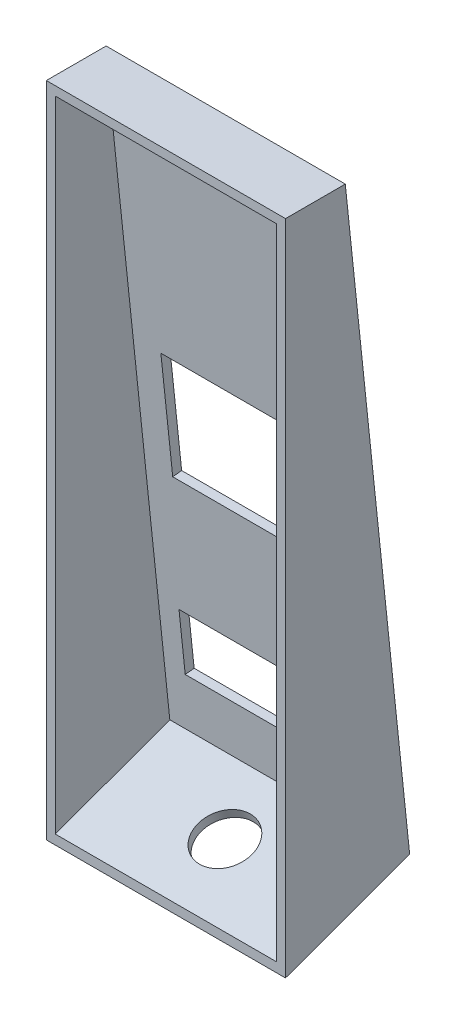
ISO-10303-21;
HEADER;
FILE_DESCRIPTION(('STEP AP214'),'2;1');
FILE_NAME('part.step','',(''),(''),'','','');
FILE_SCHEMA(('AUTOMOTIVE_DESIGN { 1 0 10303 214 1 1 1 1 }'));
ENDSEC;
DATA;
#1=APPLICATION_CONTEXT('core data for automotive mechanical design processes');
#2=APPLICATION_PROTOCOL_DEFINITION('international standard','automotive_design',2000,#1);
#3=PRODUCT_CONTEXT('',#1,'mechanical');
#4=PRODUCT('Part','Part','',(#3));
#5=PRODUCT_RELATED_PRODUCT_CATEGORY('part','',(#4));
#6=PRODUCT_DEFINITION_FORMATION('','',#4);
#7=PRODUCT_DEFINITION_CONTEXT('part definition',#1,'design');
#8=PRODUCT_DEFINITION('design','',#6,#7);
#9=PRODUCT_DEFINITION_SHAPE('','',#8);
#10=(LENGTH_UNIT() NAMED_UNIT(*) SI_UNIT(.MILLI.,.METRE.));
#11=(NAMED_UNIT(*) PLANE_ANGLE_UNIT() SI_UNIT($,.RADIAN.));
#12=(NAMED_UNIT(*) SI_UNIT($,.STERADIAN.) SOLID_ANGLE_UNIT());
#13=UNCERTAINTY_MEASURE_WITH_UNIT(LENGTH_MEASURE(1.E-05),#10,'distance_accuracy_value','');
#14=(GEOMETRIC_REPRESENTATION_CONTEXT(3) GLOBAL_UNCERTAINTY_ASSIGNED_CONTEXT((#13)) GLOBAL_UNIT_ASSIGNED_CONTEXT((#10,
#11,#12)) REPRESENTATION_CONTEXT('',''));
#15=CARTESIAN_POINT('',(0.,0.,0.));
#16=DIRECTION('',(0.,0.,1.));
#17=DIRECTION('',(1.,0.,0.));
#18=AXIS2_PLACEMENT_3D('',#15,#16,#17);
#19=CARTESIAN_POINT('',(0.,0.,0.));
#20=DIRECTION('',(0.,0.,-1.));
#21=DIRECTION('',(-1.,0.,0.));
#22=AXIS2_PLACEMENT_3D('',#19,#20,#21);
#23=PLANE('',#22);
#24=DIRECTION('',(0.,1.,0.));
#25=VECTOR('',#24,1.);
#26=CARTESIAN_POINT('',(0.,-2930.,0.));
#27=LINE('',#26,#25);
#28=CARTESIAN_POINT('',(1.50631556295124E-13,-4030.,0.));
#29=VERTEX_POINT('',#28);
#30=CARTESIAN_POINT('',(0.,-2930.,0.));
#31=VERTEX_POINT('',#30);
#32=EDGE_CURVE('E368',#29,#31,#27,.T.);
#33=ORIENTED_EDGE('',*,*,#32,.T.);
#34=DIRECTION('',(-1.,0.,0.));
#35=VECTOR('',#34,1.);
#36=CARTESIAN_POINT('',(0.,-2930.,0.));
#37=LINE('',#36,#35);
#38=CARTESIAN_POINT('',(-400.,-2930.,0.));
#39=VERTEX_POINT('',#38);
#40=EDGE_CURVE('E12',#31,#39,#37,.T.);
#41=ORIENTED_EDGE('',*,*,#40,.T.);
#42=DIRECTION('',(0.,-1.,0.));
#43=VECTOR('',#42,1.);
#44=CARTESIAN_POINT('',(-400.,-2930.,0.));
#45=LINE('',#44,#43);
#46=CARTESIAN_POINT('',(-400.,-4030.,0.));
#47=VERTEX_POINT('',#46);
#48=EDGE_CURVE('E54',#39,#47,#45,.T.);
#49=ORIENTED_EDGE('',*,*,#48,.T.);
#50=DIRECTION('',(1.,0.,0.));
#51=VECTOR('',#50,1.);
#52=CARTESIAN_POINT('',(1.50631556295124E-13,-4030.,0.));
#53=LINE('',#52,#51);
#54=EDGE_CURVE('E371',#47,#29,#53,.T.);
#55=ORIENTED_EDGE('',*,*,#54,.T.);
#56=EDGE_LOOP('',(#33,#41,#49,#55));
#57=FACE_BOUND('',#56,.T.);
#58=DIRECTION('',(0.,1.,0.));
#59=VECTOR('',#58,1.);
#60=CARTESIAN_POINT('',(-15.0000000000004,0.,0.));
#61=LINE('',#60,#59);
#62=CARTESIAN_POINT('',(-14.9999999999999,-4014.03587983747,0.));
#63=VERTEX_POINT('',#62);
#64=CARTESIAN_POINT('',(-15.,-2945.,0.));
#65=VERTEX_POINT('',#64);
#66=EDGE_CURVE('E195',#63,#65,#61,.T.);
#67=ORIENTED_EDGE('',*,*,#66,.F.);
#68=DIRECTION('',(1.,0.,0.));
#69=VECTOR('',#68,1.);
#70=CARTESIAN_POINT('',(0.,-4014.03587983747,0.));
#71=LINE('',#70,#69);
#72=CARTESIAN_POINT('',(-385.,-4014.03587983747,0.));
#73=VERTEX_POINT('',#72);
#74=EDGE_CURVE('E173',#73,#63,#71,.T.);
#75=ORIENTED_EDGE('',*,*,#74,.F.);
#76=DIRECTION('',(0.,-1.,0.));
#77=VECTOR('',#76,1.);
#78=CARTESIAN_POINT('',(-385.,0.,0.));
#79=LINE('',#78,#77);
#80=CARTESIAN_POINT('',(-385.,-2945.,0.));
#81=VERTEX_POINT('',#80);
#82=EDGE_CURVE('E212',#81,#73,#79,.T.);
#83=ORIENTED_EDGE('',*,*,#82,.F.);
#84=DIRECTION('',(-1.,0.,0.));
#85=VECTOR('',#84,1.);
#86=CARTESIAN_POINT('',(0.,-2945.,0.));
#87=LINE('',#86,#85);
#88=EDGE_CURVE('E214',#65,#81,#87,.T.);
#89=ORIENTED_EDGE('',*,*,#88,.F.);
#90=EDGE_LOOP('',(#67,#75,#83,#89));
#91=FACE_BOUND('',#90,.T.);
#92=ADVANCED_FACE('F45',(#57,#91),#23,.F.);
#93=CARTESIAN_POINT('',(-61.5,-3362.87083817174,-95.2211444366778));
#94=DIRECTION('',(0.,-0.994521895368273,-0.104528463267654));
#95=DIRECTION('',(0.,0.104528463267654,-0.994521895368273));
#96=AXIS2_PLACEMENT_3D('',#93,#94,#95);
#97=PLANE('',#96);
#98=DIRECTION('',(0.,0.104528463267654,-0.994521895368273));
#99=VECTOR('',#98,1.);
#100=CARTESIAN_POINT('',(-61.5,-3362.87083817174,-95.2211444366778));
#101=LINE('',#100,#99);
#102=CARTESIAN_POINT('',(-61.5,-3359.21234195737,-130.029410774567));
#103=VERTEX_POINT('',#102);
#104=CARTESIAN_POINT('',(-61.5,-3357.64441500836,-144.947239205091));
#105=VERTEX_POINT('',#104);
#106=EDGE_CURVE('E245',#103,#105,#101,.T.);
#107=ORIENTED_EDGE('',*,*,#106,.F.);
#108=DIRECTION('',(-1.,0.,0.));
#109=VECTOR('',#108,1.);
#110=CARTESIAN_POINT('',(0.,-3359.21234195737,-130.029410774567));
#111=LINE('',#110,#109);
#112=CARTESIAN_POINT('',(-338.5,-3359.21234195737,-130.029410774567));
#113=VERTEX_POINT('',#112);
#114=EDGE_CURVE('E70',#103,#113,#111,.T.);
#115=ORIENTED_EDGE('',*,*,#114,.T.);
#116=DIRECTION('',(0.,0.104528463267654,-0.994521895368273));
#117=VECTOR('',#116,1.);
#118=CARTESIAN_POINT('',(-338.5,-3362.87083817174,-95.2211444366778));
#119=LINE('',#118,#117);
#120=CARTESIAN_POINT('',(-338.5,-3357.64441500836,-144.947239205091));
#121=VERTEX_POINT('',#120);
#122=EDGE_CURVE('E216',#113,#121,#119,.T.);
#123=ORIENTED_EDGE('',*,*,#122,.T.);
#124=DIRECTION('',(-1.,0.,0.));
#125=VECTOR('',#124,1.);
#126=CARTESIAN_POINT('',(-61.5,-3357.64441500836,-144.947239205091));
#127=LINE('',#126,#125);
#128=EDGE_CURVE('E222',#105,#121,#127,.T.);
#129=ORIENTED_EDGE('',*,*,#128,.F.);
#130=EDGE_LOOP('',(#107,#115,#123,#129));
#131=FACE_BOUND('',#130,.T.);
#132=ADVANCED_FACE('F426',(#131),#97,.T.);
#133=CARTESIAN_POINT('',(-338.5,-3362.87083817174,-95.2211444366778));
#134=DIRECTION('',(1.,0.,0.));
#135=DIRECTION('',(0.,0.,-1.));
#136=AXIS2_PLACEMENT_3D('',#133,#134,#135);
#137=PLANE('',#136);
#138=ORIENTED_EDGE('',*,*,#122,.F.);
#139=DIRECTION('',(0.,-0.994521895368273,-0.104528463267654));
#140=VECTOR('',#139,1.);
#141=CARTESIAN_POINT('',(-338.5,-23.1861073331016,220.601075441851));
#142=LINE('',#141,#140);
#143=CARTESIAN_POINT('',(-338.5,-3548.17150207734,-149.889818795421));
#144=VERTEX_POINT('',#143);
#145=EDGE_CURVE('E207',#113,#144,#142,.T.);
#146=ORIENTED_EDGE('',*,*,#145,.T.);
#147=DIRECTION('',(0.,0.104528463267654,-0.994521895368273));
#148=VECTOR('',#147,1.);
#149=CARTESIAN_POINT('',(-338.5,-3551.82999829171,-115.081552457532));
#150=LINE('',#149,#148);
#151=CARTESIAN_POINT('',(-338.5,-3546.60357512833,-164.807647225946));
#152=VERTEX_POINT('',#151);
#153=EDGE_CURVE('E241',#144,#152,#150,.T.);
#154=ORIENTED_EDGE('',*,*,#153,.T.);
#155=DIRECTION('',(0.,-0.994521895368273,-0.104528463267653));
#156=VECTOR('',#155,1.);
#157=CARTESIAN_POINT('',(-338.5,-3357.64441500836,-144.947239205091));
#158=LINE('',#157,#156);
#159=EDGE_CURVE('E253',#121,#152,#158,.T.);
#160=ORIENTED_EDGE('',*,*,#159,.F.);
#161=EDGE_LOOP('',(#138,#146,#154,#160));
#162=FACE_BOUND('',#161,.T.);
#163=ADVANCED_FACE('F430',(#162),#137,.T.);
#164=CARTESIAN_POINT('',(-61.5,-3551.82999829171,-115.081552457532));
#165=DIRECTION('',(0.,-0.994521895368273,-0.104528463267654));
#166=DIRECTION('',(0.,0.104528463267654,-0.994521895368273));
#167=AXIS2_PLACEMENT_3D('',#164,#165,#166);
#168=PLANE('',#167);
#169=DIRECTION('',(-1.,0.,0.));
#170=VECTOR('',#169,1.);
#171=CARTESIAN_POINT('',(0.,-3548.17150207734,-149.889818795421));
#172=LINE('',#171,#170);
#173=CARTESIAN_POINT('',(-61.5,-3548.17150207734,-149.889818795421));
#174=VERTEX_POINT('',#173);
#175=EDGE_CURVE('E205',#174,#144,#172,.T.);
#176=ORIENTED_EDGE('',*,*,#175,.F.);
#177=DIRECTION('',(0.,0.104528463267654,-0.994521895368273));
#178=VECTOR('',#177,1.);
#179=CARTESIAN_POINT('',(-61.5,-3551.82999829171,-115.081552457532));
#180=LINE('',#179,#178);
#181=CARTESIAN_POINT('',(-61.5,-3546.60357512833,-164.807647225946));
#182=VERTEX_POINT('',#181);
#183=EDGE_CURVE('E243',#174,#182,#180,.T.);
#184=ORIENTED_EDGE('',*,*,#183,.T.);
#185=DIRECTION('',(-1.,0.,0.));
#186=VECTOR('',#185,1.);
#187=CARTESIAN_POINT('',(-61.5,-3546.60357512833,-164.807647225946));
#188=LINE('',#187,#186);
#189=EDGE_CURVE('E250',#182,#152,#188,.T.);
#190=ORIENTED_EDGE('',*,*,#189,.T.);
#191=ORIENTED_EDGE('',*,*,#153,.F.);
#192=EDGE_LOOP('',(#176,#184,#190,#191));
#193=FACE_BOUND('',#192,.T.);
#194=ADVANCED_FACE('F436',(#193),#168,.F.);
#195=CARTESIAN_POINT('',(-61.5,-3362.87083817174,-95.2211444366778));
#196=DIRECTION('',(1.,0.,0.));
#197=DIRECTION('',(0.,0.,-1.));
#198=AXIS2_PLACEMENT_3D('',#195,#196,#197);
#199=PLANE('',#198);
#200=DIRECTION('',(0.,-0.994521895368273,-0.104528463267654));
#201=VECTOR('',#200,1.);
#202=CARTESIAN_POINT('',(-61.5,-23.1861073331016,220.601075441851));
#203=LINE('',#202,#201);
#204=EDGE_CURVE('E203',#103,#174,#203,.T.);
#205=ORIENTED_EDGE('',*,*,#204,.F.);
#206=ORIENTED_EDGE('',*,*,#106,.T.);
#207=DIRECTION('',(0.,-0.994521895368273,-0.104528463267653));
#208=VECTOR('',#207,1.);
#209=CARTESIAN_POINT('',(-61.5,-3357.64441500836,-144.947239205091));
#210=LINE('',#209,#208);
#211=EDGE_CURVE('E247',#105,#182,#210,.T.);
#212=ORIENTED_EDGE('',*,*,#211,.T.);
#213=ORIENTED_EDGE('',*,*,#183,.F.);
#214=EDGE_LOOP('',(#205,#206,#212,#213));
#215=FACE_BOUND('',#214,.T.);
#216=ADVANCED_FACE('F446',(#215),#199,.F.);
#217=CARTESIAN_POINT('',(0.,-3860.13178585588,-147.485376070505));
#218=DIRECTION('',(0.,-0.994521895368273,-0.104528463267654));
#219=DIRECTION('',(0.,0.104528463267654,-0.994521895368273));
#220=AXIS2_PLACEMENT_3D('',#217,#218,#219);
#221=PLANE('',#220);
#222=DIRECTION('',(-1.,0.,0.));
#223=VECTOR('',#222,1.);
#224=CARTESIAN_POINT('',(0.,-3856.47328964151,-182.293642408394));
#225=LINE('',#224,#223);
#226=CARTESIAN_POINT('',(-50.,-3856.47328964151,-182.293642408394));
#227=VERTEX_POINT('',#226);
#228=CARTESIAN_POINT('',(-350.,-3856.47328964151,-182.293642408394));
#229=VERTEX_POINT('',#228);
#230=EDGE_CURVE('E197',#227,#229,#225,.T.);
#231=ORIENTED_EDGE('',*,*,#230,.F.);
#232=DIRECTION('',(0.,0.104528463267654,-0.994521895368273));
#233=VECTOR('',#232,1.);
#234=CARTESIAN_POINT('',(-50.,-3860.13178585588,-147.485376070505));
#235=LINE('',#234,#233);
#236=CARTESIAN_POINT('',(-50.,-3854.90536269249,-197.211470838918));
#237=VERTEX_POINT('',#236);
#238=EDGE_CURVE('E232',#227,#237,#235,.T.);
#239=ORIENTED_EDGE('',*,*,#238,.T.);
#240=DIRECTION('',(-1.,0.,0.));
#241=VECTOR('',#240,1.);
#242=CARTESIAN_POINT('',(0.,-3854.90536269249,-197.211470838918));
#243=LINE('',#242,#241);
#244=CARTESIAN_POINT('',(-350.,-3854.9053626925,-197.211470838918));
#245=VERTEX_POINT('',#244);
#246=EDGE_CURVE('E218',#237,#245,#243,.T.);
#247=ORIENTED_EDGE('',*,*,#246,.T.);
#248=DIRECTION('',(0.,0.104528463267654,-0.994521895368273));
#249=VECTOR('',#248,1.);
#250=CARTESIAN_POINT('',(-350.,-3860.13178585588,-147.485376070505));
#251=LINE('',#250,#249);
#252=EDGE_CURVE('E231',#229,#245,#251,.T.);
#253=ORIENTED_EDGE('',*,*,#252,.F.);
#254=EDGE_LOOP('',(#231,#239,#247,#253));
#255=FACE_BOUND('',#254,.T.);
#256=ADVANCED_FACE('F441',(#255),#221,.F.);
#257=CARTESIAN_POINT('',(-49.999999999999,-26.8446035474695,255.409341779741));
#258=DIRECTION('',(-1.,0.,0.));
#259=DIRECTION('',(0.,-1.,0.));
#260=AXIS2_PLACEMENT_3D('',#257,#258,#259);
#261=PLANE('',#260);
#262=ORIENTED_EDGE('',*,*,#238,.F.);
#263=DIRECTION('',(0.,0.994521895368273,0.104528463267654));
#264=VECTOR('',#263,1.);
#265=CARTESIAN_POINT('',(-49.999999999999,-23.1861073331016,220.601075441851));
#266=LINE('',#265,#264);
#267=CARTESIAN_POINT('',(-50.,-3757.02110010468,-171.840796081628));
#268=VERTEX_POINT('',#267);
#269=EDGE_CURVE('E181',#227,#268,#266,.T.);
#270=ORIENTED_EDGE('',*,*,#269,.T.);
#271=DIRECTION('',(0.,0.104528463267654,-0.994521895368273));
#272=VECTOR('',#271,1.);
#273=CARTESIAN_POINT('',(-50.,-3760.67959631905,-137.032529743739));
#274=LINE('',#273,#272);
#275=CARTESIAN_POINT('',(-50.,-3755.45317315567,-186.758624512153));
#276=VERTEX_POINT('',#275);
#277=EDGE_CURVE('E235',#268,#276,#274,.T.);
#278=ORIENTED_EDGE('',*,*,#277,.T.);
#279=DIRECTION('',(0.,0.994521895368273,0.104528463267654));
#280=VECTOR('',#279,1.);
#281=CARTESIAN_POINT('',(-49.999999999999,-21.6181803840868,205.683247011327));
#282=LINE('',#281,#280);
#283=EDGE_CURVE('E228',#237,#276,#282,.T.);
#284=ORIENTED_EDGE('',*,*,#283,.F.);
#285=EDGE_LOOP('',(#262,#270,#278,#284));
#286=FACE_BOUND('',#285,.T.);
#287=ADVANCED_FACE('F513',(#286),#261,.T.);
#288=CARTESIAN_POINT('',(0.,-3760.67959631905,-137.032529743739));
#289=DIRECTION('',(0.,-0.994521895368273,-0.104528463267654));
#290=DIRECTION('',(0.,0.104528463267654,-0.994521895368273));
#291=AXIS2_PLACEMENT_3D('',#288,#289,#290);
#292=PLANE('',#291);
#293=ORIENTED_EDGE('',*,*,#277,.F.);
#294=DIRECTION('',(-1.,0.,0.));
#295=VECTOR('',#294,1.);
#296=CARTESIAN_POINT('',(0.,-3757.02110010468,-171.840796081628));
#297=LINE('',#296,#295);
#298=CARTESIAN_POINT('',(-350.,-3757.02110010468,-171.840796081628));
#299=VERTEX_POINT('',#298);
#300=EDGE_CURVE('E184',#268,#299,#297,.T.);
#301=ORIENTED_EDGE('',*,*,#300,.T.);
#302=DIRECTION('',(0.,0.104528463267654,-0.994521895368273));
#303=VECTOR('',#302,1.);
#304=CARTESIAN_POINT('',(-350.,-3760.67959631905,-137.032529743739));
#305=LINE('',#304,#303);
#306=CARTESIAN_POINT('',(-350.,-3755.45317315567,-186.758624512153));
#307=VERTEX_POINT('',#306);
#308=EDGE_CURVE('E237',#299,#307,#305,.T.);
#309=ORIENTED_EDGE('',*,*,#308,.T.);
#310=DIRECTION('',(-1.,0.,0.));
#311=VECTOR('',#310,1.);
#312=CARTESIAN_POINT('',(0.,-3755.45317315567,-186.758624512153));
#313=LINE('',#312,#311);
#314=EDGE_CURVE('E225',#276,#307,#313,.T.);
#315=ORIENTED_EDGE('',*,*,#314,.F.);
#316=EDGE_LOOP('',(#293,#301,#309,#315));
#317=FACE_BOUND('',#316,.T.);
#318=ADVANCED_FACE('F516',(#317),#292,.T.);
#319=CARTESIAN_POINT('',(-350.000000000002,-26.8446035474697,255.409341779741));
#320=DIRECTION('',(-1.,0.,0.));
#321=DIRECTION('',(0.,-1.,0.));
#322=AXIS2_PLACEMENT_3D('',#319,#320,#321);
#323=PLANE('',#322);
#324=DIRECTION('',(0.,0.994521895368273,0.104528463267654));
#325=VECTOR('',#324,1.);
#326=CARTESIAN_POINT('',(-350.000000000002,-23.1861073331018,220.601075441851));
#327=LINE('',#326,#325);
#328=EDGE_CURVE('E199',#229,#299,#327,.T.);
#329=ORIENTED_EDGE('',*,*,#328,.F.);
#330=ORIENTED_EDGE('',*,*,#252,.T.);
#331=DIRECTION('',(0.,0.994521895368273,0.104528463267654));
#332=VECTOR('',#331,1.);
#333=CARTESIAN_POINT('',(-350.000000000002,-21.618180384087,205.683247011327));
#334=LINE('',#333,#332);
#335=EDGE_CURVE('E221',#245,#307,#334,.T.);
#336=ORIENTED_EDGE('',*,*,#335,.T.);
#337=ORIENTED_EDGE('',*,*,#308,.F.);
#338=EDGE_LOOP('',(#329,#330,#336,#337));
#339=FACE_BOUND('',#338,.T.);
#340=ADVANCED_FACE('F422',(#339),#323,.F.);
#341=CARTESIAN_POINT('',(0.,-21.6181803840868,205.683247011327));
#342=DIRECTION('',(0.,0.104528463267654,-0.994521895368273));
#343=DIRECTION('',(0.,0.994521895368273,0.104528463267654));
#344=AXIS2_PLACEMENT_3D('',#341,#342,#343);
#345=PLANE('',#344);
#346=ORIENTED_EDGE('',*,*,#246,.F.);
#347=ORIENTED_EDGE('',*,*,#283,.T.);
#348=ORIENTED_EDGE('',*,*,#314,.T.);
#349=ORIENTED_EDGE('',*,*,#335,.F.);
#350=EDGE_LOOP('',(#346,#347,#348,#349));
#351=FACE_BOUND('',#350,.T.);
#352=DIRECTION('',(0.,-0.994521895368273,-0.104528463267654));
#353=VECTOR('',#352,1.);
#354=CARTESIAN_POINT('',(0.,-2930.,-99.9999999999999));
#355=LINE('',#354,#353);
#356=CARTESIAN_POINT('',(0.,-2930.,-99.9999999999999));
#357=VERTEX_POINT('',#356);
#358=CARTESIAN_POINT('',(0.,-3954.35755222932,-207.664317165683));
#359=VERTEX_POINT('',#358);
#360=EDGE_CURVE('E234',#357,#359,#355,.T.);
#361=ORIENTED_EDGE('',*,*,#360,.T.);
#362=DIRECTION('',(-1.,0.,0.));
#363=VECTOR('',#362,1.);
#364=CARTESIAN_POINT('',(0.,-3954.35755222932,-207.664317165683));
#365=LINE('',#364,#363);
#366=CARTESIAN_POINT('',(-400.,-3954.35755222932,-207.664317165683));
#367=VERTEX_POINT('',#366);
#368=EDGE_CURVE('E339',#359,#367,#365,.T.);
#369=ORIENTED_EDGE('',*,*,#368,.T.);
#370=DIRECTION('',(0.,0.994521895368273,0.104528463267654));
#371=VECTOR('',#370,1.);
#372=CARTESIAN_POINT('',(-400.,-2930.,-99.9999999999999));
#373=LINE('',#372,#371);
#374=CARTESIAN_POINT('',(-400.,-2930.,-99.9999999999999));
#375=VERTEX_POINT('',#374);
#376=EDGE_CURVE('E474',#367,#375,#373,.T.);
#377=ORIENTED_EDGE('',*,*,#376,.T.);
#378=DIRECTION('',(1.,0.,0.));
#379=VECTOR('',#378,1.);
#380=CARTESIAN_POINT('',(0.,-2930.,-99.9999999999999));
#381=LINE('',#380,#379);
#382=EDGE_CURVE('E263',#375,#357,#381,.T.);
#383=ORIENTED_EDGE('',*,*,#382,.T.);
#384=EDGE_LOOP('',(#361,#369,#377,#383));
#385=FACE_BOUND('',#384,.T.);
#386=ORIENTED_EDGE('',*,*,#211,.F.);
#387=ORIENTED_EDGE('',*,*,#128,.T.);
#388=ORIENTED_EDGE('',*,*,#159,.T.);
#389=ORIENTED_EDGE('',*,*,#189,.F.);
#390=EDGE_LOOP('',(#386,#387,#388,#389));
#391=FACE_BOUND('',#390,.T.);
#392=ADVANCED_FACE('F417',(#351,#385,#391),#345,.T.);
#393=CARTESIAN_POINT('',(0.,-3557.93154621514,-1295.98890569872));
#394=DIRECTION('',(0.,0.939607059285868,0.342255130188232));
#395=DIRECTION('',(0.,-0.342255130188232,0.939607059285868));
#396=AXIS2_PLACEMENT_3D('',#393,#394,#395);
#397=PLANE('',#396);
#398=CARTESIAN_POINT('',(-200.,-3992.17877611466,-103.832158582843));
#399=DIRECTION('',(0.,-0.939607059285867,-0.342255130188236));
#400=DIRECTION('',(0.,0.342255130188236,-0.939607059285866));
#401=AXIS2_PLACEMENT_3D('',#398,#399,#400);
#402=CIRCLE('',#401,45.);
#403=CARTESIAN_POINT('',(-200.,-3976.77729525619,-146.114476250707));
#404=VERTEX_POINT('',#403);
#405=EDGE_CURVE('E187',#404,#404,#402,.T.);
#406=ORIENTED_EDGE('',*,*,#405,.F.);
#407=EDGE_LOOP('',(#406));
#408=FACE_BOUND('',#407,.T.);
#409=DIRECTION('',(0.,-0.342255130188232,0.939607059285868));
#410=VECTOR('',#409,1.);
#411=CARTESIAN_POINT('',(0.,-3954.35755222932,-207.664317165683));
#412=LINE('',#411,#410);
#413=EDGE_CURVE('E331',#359,#29,#412,.T.);
#414=ORIENTED_EDGE('',*,*,#413,.T.);
#415=ORIENTED_EDGE('',*,*,#54,.F.);
#416=DIRECTION('',(0.,-0.342255130188232,0.939607059285868));
#417=VECTOR('',#416,1.);
#418=CARTESIAN_POINT('',(-400.,-3954.35755222932,-207.664317165683));
#419=LINE('',#418,#417);
#420=EDGE_CURVE('E323',#367,#47,#419,.T.);
#421=ORIENTED_EDGE('',*,*,#420,.F.);
#422=ORIENTED_EDGE('',*,*,#368,.F.);
#423=EDGE_LOOP('',(#414,#415,#421,#422));
#424=FACE_BOUND('',#423,.T.);
#425=ADVANCED_FACE('F313',(#408,#424),#397,.F.);
#426=CARTESIAN_POINT('',(-400.,0.,1.0298214702507E-13));
#427=DIRECTION('',(-1.,0.,0.));
#428=DIRECTION('',(0.,0.,1.));
#429=AXIS2_PLACEMENT_3D('',#426,#427,#428);
#430=PLANE('',#429);
#431=ORIENTED_EDGE('',*,*,#420,.T.);
#432=ORIENTED_EDGE('',*,*,#48,.F.);
#433=DIRECTION('',(0.,0.,1.));
#434=VECTOR('',#433,1.);
#435=CARTESIAN_POINT('',(-400.,-2930.,-99.9999999999999));
#436=LINE('',#435,#434);
#437=EDGE_CURVE('E268',#375,#39,#436,.T.);
#438=ORIENTED_EDGE('',*,*,#437,.F.);
#439=ORIENTED_EDGE('',*,*,#376,.F.);
#440=EDGE_LOOP('',(#431,#432,#438,#439));
#441=FACE_BOUND('',#440,.T.);
#442=ADVANCED_FACE('F304',(#441),#430,.T.);
#443=CARTESIAN_POINT('',(-4.01227690858831E-13,0.,0.));
#444=DIRECTION('',(-1.,0.,0.));
#445=DIRECTION('',(0.,-1.,0.));
#446=AXIS2_PLACEMENT_3D('',#443,#444,#445);
#447=PLANE('',#446);
#448=DIRECTION('',(0.,0.,1.));
#449=VECTOR('',#448,1.);
#450=CARTESIAN_POINT('',(0.,-2930.,-99.9999999999999));
#451=LINE('',#450,#449);
#452=EDGE_CURVE('E330',#357,#31,#451,.T.);
#453=ORIENTED_EDGE('',*,*,#452,.T.);
#454=ORIENTED_EDGE('',*,*,#32,.F.);
#455=ORIENTED_EDGE('',*,*,#413,.F.);
#456=ORIENTED_EDGE('',*,*,#360,.F.);
#457=EDGE_LOOP('',(#453,#454,#455,#456));
#458=FACE_BOUND('',#457,.T.);
#459=ADVANCED_FACE('F279',(#458),#447,.F.);
#460=CARTESIAN_POINT('',(0.,-2930.,1.30118138486068E-11));
#461=DIRECTION('',(0.,-1.,0.));
#462=DIRECTION('',(0.,0.,-1.));
#463=AXIS2_PLACEMENT_3D('',#460,#461,#462);
#464=PLANE('',#463);
#465=ORIENTED_EDGE('',*,*,#437,.T.);
#466=ORIENTED_EDGE('',*,*,#40,.F.);
#467=ORIENTED_EDGE('',*,*,#452,.F.);
#468=ORIENTED_EDGE('',*,*,#382,.F.);
#469=EDGE_LOOP('',(#465,#466,#467,#468));
#470=FACE_BOUND('',#469,.T.);
#471=ADVANCED_FACE('F270',(#470),#464,.F.);
#472=CARTESIAN_POINT('',(0.,-23.1861073331016,220.601075441851));
#473=DIRECTION('',(0.,0.104528463267654,-0.994521895368273));
#474=DIRECTION('',(0.,0.994521895368273,0.104528463267654));
#475=AXIS2_PLACEMENT_3D('',#472,#473,#474);
#476=PLANE('',#475);
#477=ORIENTED_EDGE('',*,*,#230,.T.);
#478=ORIENTED_EDGE('',*,*,#328,.T.);
#479=ORIENTED_EDGE('',*,*,#300,.F.);
#480=ORIENTED_EDGE('',*,*,#269,.F.);
#481=EDGE_LOOP('',(#477,#478,#479,#480));
#482=FACE_BOUND('',#481,.T.);
#483=DIRECTION('',(0.,-0.994521895368273,-0.104528463267654));
#484=VECTOR('',#483,1.);
#485=CARTESIAN_POINT('',(-15.0000000000004,-23.1861073331016,220.601075441851));
#486=LINE('',#485,#484);
#487=CARTESIAN_POINT('',(-15.,-2945.,-86.4939393355323));
#488=VERTEX_POINT('',#487);
#489=CARTESIAN_POINT('',(-14.9999999999999,-3944.27339787691,-191.521805640719));
#490=VERTEX_POINT('',#489);
#491=EDGE_CURVE('E164',#488,#490,#486,.T.);
#492=ORIENTED_EDGE('',*,*,#491,.F.);
#493=DIRECTION('',(1.,0.,0.));
#494=VECTOR('',#493,1.);
#495=CARTESIAN_POINT('',(0.,-2945.,-86.4939393355323));
#496=LINE('',#495,#494);
#497=CARTESIAN_POINT('',(-385.,-2945.,-86.4939393355323));
#498=VERTEX_POINT('',#497);
#499=EDGE_CURVE('E177',#498,#488,#496,.T.);
#500=ORIENTED_EDGE('',*,*,#499,.F.);
#501=DIRECTION('',(0.,0.994521895368274,0.104528463267654));
#502=VECTOR('',#501,1.);
#503=CARTESIAN_POINT('',(-385.,-23.1861073331016,220.601075441851));
#504=LINE('',#503,#502);
#505=CARTESIAN_POINT('',(-385.,-3944.27339787691,-191.521805640719));
#506=VERTEX_POINT('',#505);
#507=EDGE_CURVE('E167',#506,#498,#504,.T.);
#508=ORIENTED_EDGE('',*,*,#507,.F.);
#509=DIRECTION('',(-1.,0.,0.));
#510=VECTOR('',#509,1.);
#511=CARTESIAN_POINT('',(0.,-3944.27339787691,-191.521805640719));
#512=LINE('',#511,#510);
#513=EDGE_CURVE('E159',#490,#506,#512,.T.);
#514=ORIENTED_EDGE('',*,*,#513,.F.);
#515=EDGE_LOOP('',(#492,#500,#508,#514));
#516=FACE_BOUND('',#515,.T.);
#517=ORIENTED_EDGE('',*,*,#204,.T.);
#518=ORIENTED_EDGE('',*,*,#175,.T.);
#519=ORIENTED_EDGE('',*,*,#145,.F.);
#520=ORIENTED_EDGE('',*,*,#114,.F.);
#521=EDGE_LOOP('',(#517,#518,#519,#520));
#522=FACE_BOUND('',#521,.T.);
#523=ADVANCED_FACE('F161',(#482,#516,#522),#476,.F.);
#524=CARTESIAN_POINT('',(0.,-3543.83744032585,-1290.85507874589));
#525=DIRECTION('',(0.,0.939607059285868,0.342255130188232));
#526=DIRECTION('',(0.,-0.342255130188232,0.939607059285868));
#527=AXIS2_PLACEMENT_3D('',#524,#525,#526);
#528=PLANE('',#527);
#529=CARTESIAN_POINT('',(-200.,-3978.08467022537,-98.6983316300185));
#530=DIRECTION('',(0.,0.939607059285868,0.342255130188232));
#531=DIRECTION('',(0.,-0.342255130188232,0.939607059285868));
#532=AXIS2_PLACEMENT_3D('',#529,#530,#531);
#533=CIRCLE('',#532,45.);
#534=CARTESIAN_POINT('',(-200.,-3993.48615108384,-56.4160139621544));
#535=VERTEX_POINT('',#534);
#536=EDGE_CURVE('E49',#535,#535,#533,.T.);
#537=ORIENTED_EDGE('',*,*,#536,.F.);
#538=EDGE_LOOP('',(#537));
#539=FACE_BOUND('',#538,.T.);
#540=DIRECTION('',(0.,-0.342255130188232,0.939607059285868));
#541=VECTOR('',#540,1.);
#542=CARTESIAN_POINT('',(-14.9999999999999,-3543.83744032585,-1290.85507874589));
#543=LINE('',#542,#541);
#544=EDGE_CURVE('E170',#490,#63,#543,.T.);
#545=ORIENTED_EDGE('',*,*,#544,.F.);
#546=ORIENTED_EDGE('',*,*,#513,.T.);
#547=DIRECTION('',(0.,-0.342255130188232,0.939607059285868));
#548=VECTOR('',#547,1.);
#549=CARTESIAN_POINT('',(-385.,-3543.83744032585,-1290.85507874589));
#550=LINE('',#549,#548);
#551=EDGE_CURVE('E62',#506,#73,#550,.T.);
#552=ORIENTED_EDGE('',*,*,#551,.T.);
#553=ORIENTED_EDGE('',*,*,#74,.T.);
#554=EDGE_LOOP('',(#545,#546,#552,#553));
#555=FACE_BOUND('',#554,.T.);
#556=ADVANCED_FACE('F171',(#539,#555),#528,.T.);
#557=CARTESIAN_POINT('',(-385.,0.,0.));
#558=DIRECTION('',(-1.,0.,0.));
#559=DIRECTION('',(0.,0.,1.));
#560=AXIS2_PLACEMENT_3D('',#557,#558,#559);
#561=PLANE('',#560);
#562=ORIENTED_EDGE('',*,*,#551,.F.);
#563=ORIENTED_EDGE('',*,*,#507,.T.);
#564=DIRECTION('',(0.,0.,1.));
#565=VECTOR('',#564,1.);
#566=CARTESIAN_POINT('',(-385.,-2945.,1.3177547546596E-11));
#567=LINE('',#566,#565);
#568=EDGE_CURVE('E192',#498,#81,#567,.T.);
#569=ORIENTED_EDGE('',*,*,#568,.T.);
#570=ORIENTED_EDGE('',*,*,#82,.T.);
#571=EDGE_LOOP('',(#562,#563,#569,#570));
#572=FACE_BOUND('',#571,.T.);
#573=ADVANCED_FACE('F498',(#572),#561,.F.);
#574=CARTESIAN_POINT('',(-15.0000000000004,0.,0.));
#575=DIRECTION('',(-1.,0.,0.));
#576=DIRECTION('',(0.,-1.,0.));
#577=AXIS2_PLACEMENT_3D('',#574,#575,#576);
#578=PLANE('',#577);
#579=DIRECTION('',(0.,0.,1.));
#580=VECTOR('',#579,1.);
#581=CARTESIAN_POINT('',(-15.,-2945.,1.30784272300844E-11));
#582=LINE('',#581,#580);
#583=EDGE_CURVE('E180',#488,#65,#582,.T.);
#584=ORIENTED_EDGE('',*,*,#583,.F.);
#585=ORIENTED_EDGE('',*,*,#491,.T.);
#586=ORIENTED_EDGE('',*,*,#544,.T.);
#587=ORIENTED_EDGE('',*,*,#66,.T.);
#588=EDGE_LOOP('',(#584,#585,#586,#587));
#589=FACE_BOUND('',#588,.T.);
#590=ADVANCED_FACE('F179',(#589),#578,.T.);
#591=CARTESIAN_POINT('',(0.,-2945.,1.30784272300844E-11));
#592=DIRECTION('',(0.,-1.,0.));
#593=DIRECTION('',(0.,0.,-1.));
#594=AXIS2_PLACEMENT_3D('',#591,#592,#593);
#595=PLANE('',#594);
#596=ORIENTED_EDGE('',*,*,#568,.F.);
#597=ORIENTED_EDGE('',*,*,#499,.T.);
#598=ORIENTED_EDGE('',*,*,#583,.T.);
#599=ORIENTED_EDGE('',*,*,#88,.T.);
#600=EDGE_LOOP('',(#596,#597,#598,#599));
#601=FACE_BOUND('',#600,.T.);
#602=ADVANCED_FACE('F509',(#601),#595,.T.);
#603=CARTESIAN_POINT('',(-200.,-3945.19842315037,-86.7194020734314));
#604=DIRECTION('',(0.,-0.939607059285866,-0.342255130188236));
#605=DIRECTION('',(0.,0.342255130188236,-0.939607059285867));
#606=AXIS2_PLACEMENT_3D('',#603,#604,#605);
#607=CYLINDRICAL_SURFACE('',#606,45.);
#608=ORIENTED_EDGE('',*,*,#536,.T.);
#609=EDGE_LOOP('',(#608));
#610=FACE_BOUND('',#609,.T.);
#611=ORIENTED_EDGE('',*,*,#405,.T.);
#612=EDGE_LOOP('',(#611));
#613=FACE_BOUND('',#612,.T.);
#614=ADVANCED_FACE('F502',(#610,#613),#607,.F.);
#615=CLOSED_SHELL('',(#92,#132,#163,#194,#216,#256,#287,#318,#340,#392,#425,#442,#459,#471,#523,
#556,#573,#590,#602,#614));
#616=MANIFOLD_SOLID_BREP('B2',#615);
#617=ADVANCED_BREP_SHAPE_REPRESENTATION('',(#18,#616),#14);
#618=SHAPE_DEFINITION_REPRESENTATION(#9,#617);
ENDSEC;
END-ISO-10303-21;
